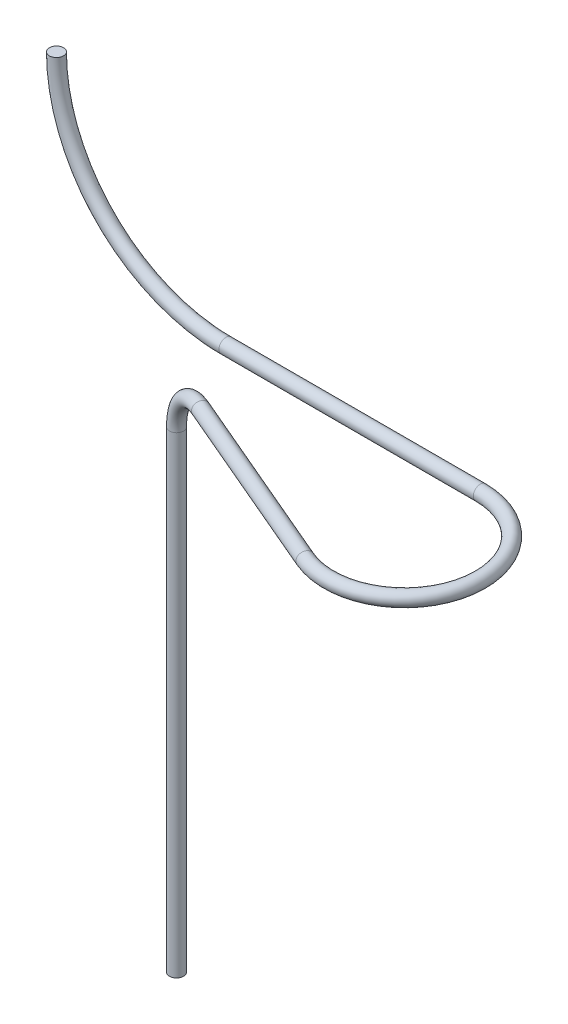
ISO-10303-21;
HEADER;
FILE_DESCRIPTION(('STEP AP214'),'2;1');
FILE_NAME('part.step','',(''),(''),'','','');
FILE_SCHEMA(('AUTOMOTIVE_DESIGN { 1 0 10303 214 1 1 1 1 }'));
ENDSEC;
DATA;
#1=APPLICATION_CONTEXT('core data for automotive mechanical design processes');
#2=APPLICATION_PROTOCOL_DEFINITION('international standard','automotive_design',2000,#1);
#3=PRODUCT_CONTEXT('',#1,'mechanical');
#4=PRODUCT('Part','Part','',(#3));
#5=PRODUCT_RELATED_PRODUCT_CATEGORY('part','',(#4));
#6=PRODUCT_DEFINITION_FORMATION('','',#4);
#7=PRODUCT_DEFINITION_CONTEXT('part definition',#1,'design');
#8=PRODUCT_DEFINITION('design','',#6,#7);
#9=PRODUCT_DEFINITION_SHAPE('','',#8);
#10=(LENGTH_UNIT() NAMED_UNIT(*) SI_UNIT(.MILLI.,.METRE.));
#11=(NAMED_UNIT(*) PLANE_ANGLE_UNIT() SI_UNIT($,.RADIAN.));
#12=(NAMED_UNIT(*) SI_UNIT($,.STERADIAN.) SOLID_ANGLE_UNIT());
#13=UNCERTAINTY_MEASURE_WITH_UNIT(LENGTH_MEASURE(1.E-05),#10,'distance_accuracy_value','');
#14=(GEOMETRIC_REPRESENTATION_CONTEXT(3) GLOBAL_UNCERTAINTY_ASSIGNED_CONTEXT((#13)) GLOBAL_UNIT_ASSIGNED_CONTEXT((#10,
#11,#12)) REPRESENTATION_CONTEXT('',''));
#15=CARTESIAN_POINT('',(0.,0.,0.));
#16=DIRECTION('',(0.,0.,1.));
#17=DIRECTION('',(1.,0.,0.));
#18=AXIS2_PLACEMENT_3D('',#15,#16,#17);
#19=CARTESIAN_POINT('',(-12.,0.,0.));
#20=DIRECTION('',(0.,1.,0.));
#21=DIRECTION('',(0.,0.,1.));
#22=AXIS2_PLACEMENT_3D('',#19,#20,#21);
#23=PLANE('',#22);
#24=CARTESIAN_POINT('',(-12.,0.,0.));
#25=DIRECTION('',(0.,1.,0.));
#26=DIRECTION('',(0.,0.,1.));
#27=AXIS2_PLACEMENT_3D('',#24,#25,#26);
#28=CIRCLE('',#27,0.500000000000001);
#29=CARTESIAN_POINT('',(-12.,0.,0.500000000000001));
#30=VERTEX_POINT('',#29);
#31=EDGE_CURVE('E48',#30,#30,#28,.T.);
#32=ORIENTED_EDGE('',*,*,#31,.T.);
#33=EDGE_LOOP('',(#32));
#34=FACE_BOUND('',#33,.T.);
#35=ADVANCED_FACE('F36',(#34),#23,.T.);
#36=CARTESIAN_POINT('',(0.,-48.67,3.5));
#37=DIRECTION('',(0.,1.,0.));
#38=DIRECTION('',(0.392805347159422,0.,-0.919621639177203));
#39=AXIS2_PLACEMENT_3D('',#36,#37,#38);
#40=PLANE('',#39);
#41=CARTESIAN_POINT('',(0.,-48.67,3.5));
#42=DIRECTION('',(0.,1.,0.));
#43=DIRECTION('',(0.392805347159422,0.,-0.919621639177203));
#44=AXIS2_PLACEMENT_3D('',#41,#42,#43);
#45=CIRCLE('',#44,0.500000000000001);
#46=CARTESIAN_POINT('',(0.196402673579717,-48.67,3.0401891804114));
#47=VERTEX_POINT('',#46);
#48=EDGE_CURVE('E11',#47,#47,#45,.T.);
#49=ORIENTED_EDGE('',*,*,#48,.F.);
#50=EDGE_LOOP('',(#49));
#51=FACE_BOUND('',#50,.T.);
#52=ADVANCED_FACE('F54',(#51),#40,.F.);
#53=CARTESIAN_POINT('',(0.,0.,0.));
#54=DIRECTION('',(0.,0.,1.));
#55=DIRECTION('',(1.,0.,0.));
#56=AXIS2_PLACEMENT_3D('',#53,#54,#55);
#57=TOROIDAL_SURFACE('',#56,12.,0.500000000000001);
#58=CARTESIAN_POINT('',(0.,-12.,0.));
#59=DIRECTION('',(-1.,0.,0.));
#60=DIRECTION('',(0.,0.,1.));
#61=AXIS2_PLACEMENT_3D('',#58,#59,#60);
#62=CIRCLE('',#61,0.500000000000001);
#63=CARTESIAN_POINT('',(0.,-12.,0.500000000000001));
#64=VERTEX_POINT('',#63);
#65=EDGE_CURVE('E92',#64,#64,#62,.T.);
#66=ORIENTED_EDGE('',*,*,#65,.T.);
#67=EDGE_LOOP('',(#66));
#68=FACE_BOUND('',#67,.T.);
#69=ORIENTED_EDGE('',*,*,#31,.F.);
#70=EDGE_LOOP('',(#69));
#71=FACE_BOUND('',#70,.T.);
#72=ADVANCED_FACE('F56',(#68,#71),#57,.T.);
#73=CARTESIAN_POINT('',(0.,-12.,0.));
#74=DIRECTION('',(1.,0.,0.));
#75=DIRECTION('',(0.,0.,-1.));
#76=AXIS2_PLACEMENT_3D('',#73,#74,#75);
#77=CYLINDRICAL_SURFACE('',#76,0.500000000000001);
#78=CARTESIAN_POINT('',(18.,-12.,0.));
#79=DIRECTION('',(-1.,0.,0.));
#80=DIRECTION('',(0.,0.,1.));
#81=AXIS2_PLACEMENT_3D('',#78,#79,#80);
#82=CIRCLE('',#81,0.500000000000001);
#83=CARTESIAN_POINT('',(18.,-12.,-0.5));
#84=VERTEX_POINT('',#83);
#85=EDGE_CURVE('E89',#84,#84,#82,.T.);
#86=ORIENTED_EDGE('',*,*,#85,.T.);
#87=EDGE_LOOP('',(#86));
#88=FACE_BOUND('',#87,.T.);
#89=ORIENTED_EDGE('',*,*,#65,.F.);
#90=EDGE_LOOP('',(#89));
#91=FACE_BOUND('',#90,.T.);
#92=ADVANCED_FACE('F61',(#88,#91),#77,.T.);
#93=CARTESIAN_POINT('',(18.,-12.,5.36));
#94=DIRECTION('',(0.,-1.,0.));
#95=DIRECTION('',(0.,0.,-1.));
#96=AXIS2_PLACEMENT_3D('',#93,#94,#95);
#97=TOROIDAL_SURFACE('',#96,5.36,0.500000000000001);
#98=CARTESIAN_POINT('',(15.8945633392255,-12.,10.2891719859898));
#99=DIRECTION('',(0.919621639177203,0.,0.392805347159422));
#100=DIRECTION('',(0.392805347159422,0.,-0.919621639177203));
#101=AXIS2_PLACEMENT_3D('',#98,#99,#100);
#102=CIRCLE('',#101,0.500000000000001);
#103=CARTESIAN_POINT('',(15.6981606656458,-12.,10.7489828055784));
#104=VERTEX_POINT('',#103);
#105=EDGE_CURVE('E94',#104,#104,#102,.T.);
#106=CARTESIAN_POINT('',(18.,-12.,5.36));
#107=DIRECTION('',(0.,-1.,0.));
#108=DIRECTION('',(0.,0.,-1.));
#109=AXIS2_PLACEMENT_3D('',#106,#107,#108);
#110=CIRCLE('',#109,5.86);
#111=EDGE_CURVE('',#84,#104,#110,.T.);
#112=ORIENTED_EDGE('',*,*,#85,.F.);
#113=ORIENTED_EDGE('',*,*,#105,.T.);
#114=ORIENTED_EDGE('',*,*,#111,.T.);
#115=ORIENTED_EDGE('',*,*,#111,.F.);
#116=EDGE_LOOP('',(#112,#114,#113,#115));
#117=FACE_BOUND('',#116,.T.);
#118=ADVANCED_FACE('F77',(#117),#97,.T.);
#119=CARTESIAN_POINT('',(15.8945633392255,-12.,10.2891719859898));
#120=DIRECTION('',(-0.919621639177203,0.,-0.392805347159422));
#121=DIRECTION('',(-0.392805347159422,0.,0.919621639177203));
#122=AXIS2_PLACEMENT_3D('',#119,#120,#121);
#123=CYLINDRICAL_SURFACE('',#122,0.500000000000001);
#124=CARTESIAN_POINT('',(2.9887703273259,-12.,4.77661737826812));
#125=DIRECTION('',(0.919621639177203,0.,0.392805347159422));
#126=DIRECTION('',(0.392805347159422,0.,-0.919621639177203));
#127=AXIS2_PLACEMENT_3D('',#124,#125,#126);
#128=CIRCLE('',#127,0.500000000000001);
#129=CARTESIAN_POINT('',(2.9887703273259,-11.5,4.77661737826812));
#130=VERTEX_POINT('',#129);
#131=EDGE_CURVE('E100',#130,#130,#128,.T.);
#132=ORIENTED_EDGE('',*,*,#131,.T.);
#133=EDGE_LOOP('',(#132));
#134=FACE_BOUND('',#133,.T.);
#135=ORIENTED_EDGE('',*,*,#105,.F.);
#136=EDGE_LOOP('',(#135));
#137=FACE_BOUND('',#136,.T.);
#138=ADVANCED_FACE('F71',(#134,#137),#123,.T.);
#139=CARTESIAN_POINT('',(2.98877032732591,-15.25,4.77661737826812));
#140=DIRECTION('',(-0.392805347159422,0.,0.919621639177203));
#141=DIRECTION('',(0.919621639177203,0.,0.392805347159422));
#142=AXIS2_PLACEMENT_3D('',#139,#140,#141);
#143=TOROIDAL_SURFACE('',#142,3.25,0.500000000000001);
#144=CARTESIAN_POINT('',(0.,-15.25,3.5));
#145=DIRECTION('',(0.,1.,0.));
#146=DIRECTION('',(0.392805347159422,0.,-0.919621639177203));
#147=AXIS2_PLACEMENT_3D('',#144,#145,#146);
#148=CIRCLE('',#147,0.500000000000001);
#149=CARTESIAN_POINT('',(-0.459810819588601,-15.25,3.30359732642029));
#150=VERTEX_POINT('',#149);
#151=EDGE_CURVE('E43',#150,#150,#148,.T.);
#152=CARTESIAN_POINT('',(2.98877032732591,-15.25,4.77661737826812));
#153=DIRECTION('',(-0.392805347159422,0.,0.919621639177203));
#154=DIRECTION('',(0.919621639177203,0.,0.392805347159422));
#155=AXIS2_PLACEMENT_3D('',#152,#153,#154);
#156=CIRCLE('',#155,3.75);
#157=EDGE_CURVE('',#130,#150,#156,.T.);
#158=ORIENTED_EDGE('',*,*,#131,.F.);
#159=ORIENTED_EDGE('',*,*,#151,.T.);
#160=ORIENTED_EDGE('',*,*,#157,.T.);
#161=ORIENTED_EDGE('',*,*,#157,.F.);
#162=EDGE_LOOP('',(#158,#160,#159,#161));
#163=FACE_BOUND('',#162,.T.);
#164=ADVANCED_FACE('F67',(#163),#143,.T.);
#165=CARTESIAN_POINT('',(0.,-15.25,3.5));
#166=DIRECTION('',(0.,-1.,0.));
#167=DIRECTION('',(1.,0.,0.));
#168=AXIS2_PLACEMENT_3D('',#165,#166,#167);
#169=CYLINDRICAL_SURFACE('',#168,0.500000000000001);
#170=ORIENTED_EDGE('',*,*,#48,.T.);
#171=EDGE_LOOP('',(#170));
#172=FACE_BOUND('',#171,.T.);
#173=ORIENTED_EDGE('',*,*,#151,.F.);
#174=EDGE_LOOP('',(#173));
#175=FACE_BOUND('',#174,.T.);
#176=ADVANCED_FACE('F51',(#172,#175),#169,.T.);
#177=CLOSED_SHELL('',(#35,#52,#72,#92,#118,#138,#164,#176));
#178=MANIFOLD_SOLID_BREP('B2',#177);
#179=ADVANCED_BREP_SHAPE_REPRESENTATION('',(#18,#178),#14);
#180=SHAPE_DEFINITION_REPRESENTATION(#9,#179);
ENDSEC;
END-ISO-10303-21;
